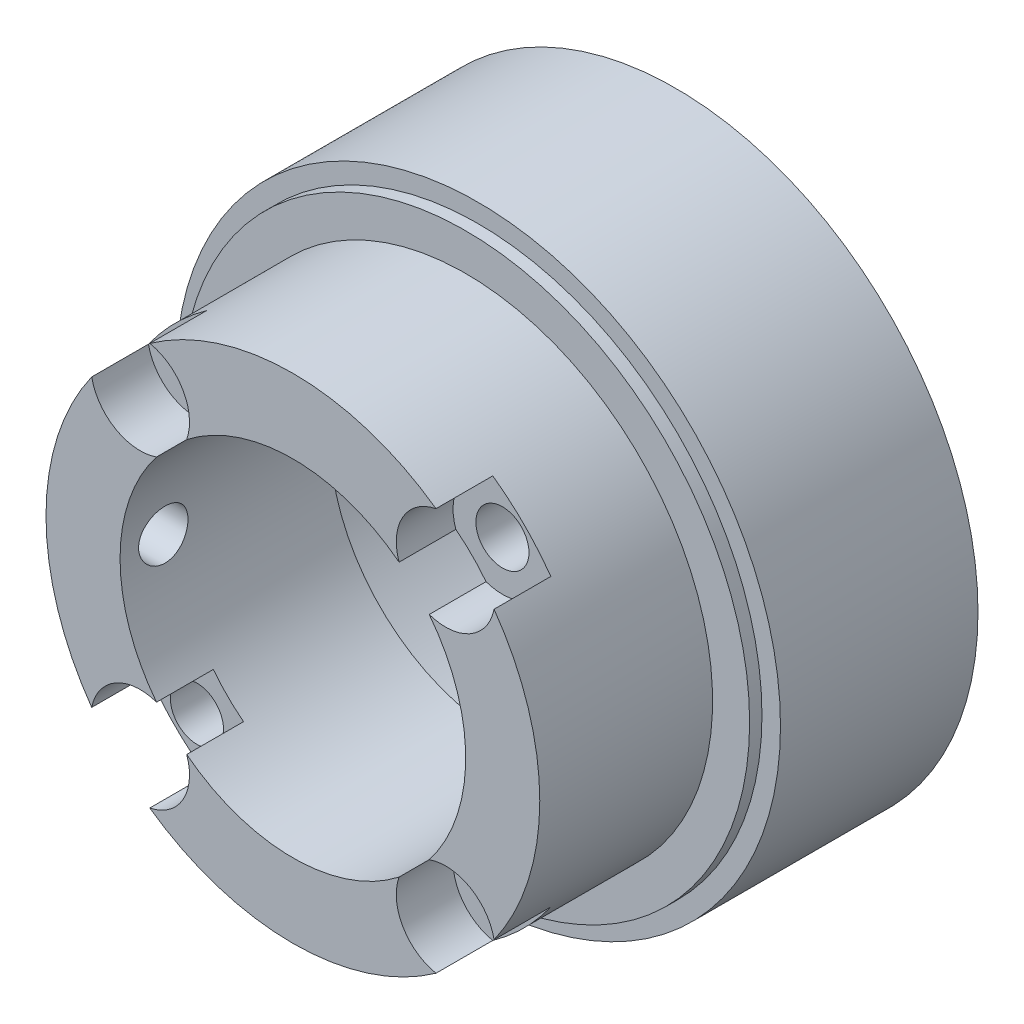
ISO-10303-21;
HEADER;
FILE_DESCRIPTION(('STEP AP214'),'2;1');
FILE_NAME('part.step','',(''),(''),'','','');
FILE_SCHEMA(('AUTOMOTIVE_DESIGN { 1 0 10303 214 1 1 1 1 }'));
ENDSEC;
DATA;
#1=APPLICATION_CONTEXT('core data for automotive mechanical design processes');
#2=APPLICATION_PROTOCOL_DEFINITION('international standard','automotive_design',2000,#1);
#3=PRODUCT_CONTEXT('',#1,'mechanical');
#4=PRODUCT('Part','Part','',(#3));
#5=PRODUCT_RELATED_PRODUCT_CATEGORY('part','',(#4));
#6=PRODUCT_DEFINITION_FORMATION('','',#4);
#7=PRODUCT_DEFINITION_CONTEXT('part definition',#1,'design');
#8=PRODUCT_DEFINITION('design','',#6,#7);
#9=PRODUCT_DEFINITION_SHAPE('','',#8);
#10=(LENGTH_UNIT() NAMED_UNIT(*) SI_UNIT(.MILLI.,.METRE.));
#11=(NAMED_UNIT(*) PLANE_ANGLE_UNIT() SI_UNIT($,.RADIAN.));
#12=(NAMED_UNIT(*) SI_UNIT($,.STERADIAN.) SOLID_ANGLE_UNIT());
#13=UNCERTAINTY_MEASURE_WITH_UNIT(LENGTH_MEASURE(1.E-05),#10,'distance_accuracy_value','');
#14=(GEOMETRIC_REPRESENTATION_CONTEXT(3) GLOBAL_UNCERTAINTY_ASSIGNED_CONTEXT((#13)) GLOBAL_UNIT_ASSIGNED_CONTEXT((#10,
#11,#12)) REPRESENTATION_CONTEXT('',''));
#15=CARTESIAN_POINT('',(0.,0.,0.));
#16=DIRECTION('',(0.,0.,1.));
#17=DIRECTION('',(1.,0.,0.));
#18=AXIS2_PLACEMENT_3D('',#15,#16,#17);
#19=CARTESIAN_POINT('',(0.,0.,0.));
#20=DIRECTION('',(0.,0.,-1.));
#21=DIRECTION('',(-1.,0.,0.));
#22=AXIS2_PLACEMENT_3D('',#19,#20,#21);
#23=PLANE('',#22);
#24=CARTESIAN_POINT('',(0.,0.,0.));
#25=DIRECTION('',(0.,0.,-1.));
#26=DIRECTION('',(-1.,0.,0.));
#27=AXIS2_PLACEMENT_3D('',#24,#25,#26);
#28=CIRCLE('',#27,20.);
#29=CARTESIAN_POINT('',(-20.,0.,0.));
#30=VERTEX_POINT('',#29);
#31=EDGE_CURVE('E307',#30,#30,#28,.T.);
#32=ORIENTED_EDGE('',*,*,#31,.T.);
#33=EDGE_LOOP('',(#32));
#34=FACE_BOUND('',#33,.T.);
#35=CARTESIAN_POINT('',(0.,0.,0.));
#36=DIRECTION('',(0.,0.,1.));
#37=DIRECTION('',(1.,0.,0.));
#38=AXIS2_PLACEMENT_3D('',#35,#36,#37);
#39=CIRCLE('',#38,23.);
#40=CARTESIAN_POINT('',(23.,0.,0.));
#41=VERTEX_POINT('',#40);
#42=EDGE_CURVE('E392',#41,#41,#39,.T.);
#43=ORIENTED_EDGE('',*,*,#42,.T.);
#44=EDGE_LOOP('',(#43));
#45=FACE_BOUND('',#44,.T.);
#46=ADVANCED_FACE('F38',(#34,#45),#23,.F.);
#47=CARTESIAN_POINT('',(0.,0.,-3.));
#48=DIRECTION('',(0.,0.,1.));
#49=DIRECTION('',(1.,0.,0.));
#50=AXIS2_PLACEMENT_3D('',#47,#48,#49);
#51=CYLINDRICAL_SURFACE('',#50,24.5);
#52=CARTESIAN_POINT('',(0.,0.,-17.));
#53=DIRECTION('',(0.,0.,-1.));
#54=DIRECTION('',(-1.,0.,0.));
#55=AXIS2_PLACEMENT_3D('',#52,#53,#54);
#56=CIRCLE('',#55,24.5);
#57=CARTESIAN_POINT('',(-24.5,0.,-17.));
#58=VERTEX_POINT('',#57);
#59=EDGE_CURVE('E299',#58,#58,#56,.T.);
#60=ORIENTED_EDGE('',*,*,#59,.F.);
#61=EDGE_LOOP('',(#60));
#62=FACE_BOUND('',#61,.T.);
#63=CARTESIAN_POINT('',(0.,0.,-1.));
#64=DIRECTION('',(0.,0.,1.));
#65=DIRECTION('',(1.,0.,0.));
#66=AXIS2_PLACEMENT_3D('',#63,#64,#65);
#67=CIRCLE('',#66,24.5);
#68=CARTESIAN_POINT('',(24.5,0.,-1.));
#69=VERTEX_POINT('',#68);
#70=EDGE_CURVE('E384',#69,#69,#67,.T.);
#71=ORIENTED_EDGE('',*,*,#70,.F.);
#72=EDGE_LOOP('',(#71));
#73=FACE_BOUND('',#72,.T.);
#74=ADVANCED_FACE('F489',(#62,#73),#51,.T.);
#75=CARTESIAN_POINT('',(0.,0.,14.));
#76=DIRECTION('',(0.,0.,1.));
#77=DIRECTION('',(1.,0.,0.));
#78=AXIS2_PLACEMENT_3D('',#75,#76,#77);
#79=PLANE('',#78);
#80=CARTESIAN_POINT('',(12.3743686707646,-12.3743686707646,14.));
#81=DIRECTION('',(0.,0.,1.));
#82=DIRECTION('',(1.,0.,0.));
#83=AXIS2_PLACEMENT_3D('',#80,#81,#82);
#84=CIRCLE('',#83,4.);
#85=CARTESIAN_POINT('',(16.2973096886323,-11.5930020664543,14.));
#86=VERTEX_POINT('',#85);
#87=CARTESIAN_POINT('',(11.0461328593506,-8.60133413218988,14.));
#88=VERTEX_POINT('',#87);
#89=EDGE_CURVE('E57',#86,#88,#84,.T.);
#90=ORIENTED_EDGE('',*,*,#89,.F.);
#91=CARTESIAN_POINT('',(0.,0.,14.));
#92=DIRECTION('',(0.,0.,1.));
#93=DIRECTION('',(1.,0.,0.));
#94=AXIS2_PLACEMENT_3D('',#91,#92,#93);
#95=CIRCLE('',#94,20.);
#96=CARTESIAN_POINT('',(16.2973096886322,11.5930020664543,14.));
#97=VERTEX_POINT('',#96);
#98=EDGE_CURVE('E207',#86,#97,#95,.T.);
#99=ORIENTED_EDGE('',*,*,#98,.T.);
#100=CARTESIAN_POINT('',(12.3743686707646,12.3743686707646,14.));
#101=DIRECTION('',(0.,0.,1.));
#102=DIRECTION('',(1.,0.,0.));
#103=AXIS2_PLACEMENT_3D('',#100,#101,#102);
#104=CIRCLE('',#103,4.);
#105=CARTESIAN_POINT('',(11.0461328593506,8.60133413218992,14.));
#106=VERTEX_POINT('',#105);
#107=EDGE_CURVE('E195',#106,#97,#104,.T.);
#108=ORIENTED_EDGE('',*,*,#107,.F.);
#109=CARTESIAN_POINT('',(0.,0.,14.));
#110=DIRECTION('',(0.,0.,1.));
#111=DIRECTION('',(1.,0.,0.));
#112=AXIS2_PLACEMENT_3D('',#109,#110,#111);
#113=CIRCLE('',#112,14.);
#114=EDGE_CURVE('E316',#88,#106,#113,.T.);
#115=ORIENTED_EDGE('',*,*,#114,.F.);
#116=EDGE_LOOP('',(#90,#99,#108,#115));
#117=FACE_BOUND('',#116,.T.);
#118=ADVANCED_FACE('F493',(#117),#79,.T.);
#119=CARTESIAN_POINT('',(11.5930020664543,16.2973096886323,14.));
#120=VERTEX_POINT('',#119);
#121=CARTESIAN_POINT('',(8.60133413218988,11.0461328593506,14.));
#122=VERTEX_POINT('',#121);
#123=EDGE_CURVE('E68',#120,#122,#104,.T.);
#124=ORIENTED_EDGE('',*,*,#123,.F.);
#125=CARTESIAN_POINT('',(-11.5930020664543,16.2973096886322,14.));
#126=VERTEX_POINT('',#125);
#127=EDGE_CURVE('E538',#120,#126,#95,.T.);
#128=ORIENTED_EDGE('',*,*,#127,.T.);
#129=CARTESIAN_POINT('',(-12.3743686707646,12.3743686707646,14.));
#130=DIRECTION('',(0.,0.,1.));
#131=DIRECTION('',(1.,0.,0.));
#132=AXIS2_PLACEMENT_3D('',#129,#130,#131);
#133=CIRCLE('',#132,4.);
#134=CARTESIAN_POINT('',(-8.60133413218993,11.0461328593506,14.));
#135=VERTEX_POINT('',#134);
#136=EDGE_CURVE('E242',#135,#126,#133,.T.);
#137=ORIENTED_EDGE('',*,*,#136,.F.);
#138=EDGE_CURVE('E517',#122,#135,#113,.T.);
#139=ORIENTED_EDGE('',*,*,#138,.F.);
#140=EDGE_LOOP('',(#124,#128,#137,#139));
#141=FACE_BOUND('',#140,.T.);
#142=ADVANCED_FACE('F504',(#141),#79,.T.);
#143=CARTESIAN_POINT('',(-16.2973096886323,11.5930020664543,14.));
#144=VERTEX_POINT('',#143);
#145=CARTESIAN_POINT('',(-11.0461328593506,8.60133413218989,14.));
#146=VERTEX_POINT('',#145);
#147=EDGE_CURVE('E246',#144,#146,#133,.T.);
#148=ORIENTED_EDGE('',*,*,#147,.F.);
#149=CARTESIAN_POINT('',(-16.2973096886322,-11.5930020664543,14.));
#150=VERTEX_POINT('',#149);
#151=EDGE_CURVE('E315',#144,#150,#95,.T.);
#152=ORIENTED_EDGE('',*,*,#151,.T.);
#153=CARTESIAN_POINT('',(-12.3743686707646,-12.3743686707646,14.));
#154=DIRECTION('',(0.,0.,1.));
#155=DIRECTION('',(1.,0.,0.));
#156=AXIS2_PLACEMENT_3D('',#153,#154,#155);
#157=CIRCLE('',#156,4.);
#158=CARTESIAN_POINT('',(-11.0461328593506,-8.60133413218994,14.));
#159=VERTEX_POINT('',#158);
#160=EDGE_CURVE('E272',#159,#150,#157,.T.);
#161=ORIENTED_EDGE('',*,*,#160,.F.);
#162=EDGE_CURVE('E311',#146,#159,#113,.T.);
#163=ORIENTED_EDGE('',*,*,#162,.F.);
#164=EDGE_LOOP('',(#148,#152,#161,#163));
#165=FACE_BOUND('',#164,.T.);
#166=ADVANCED_FACE('F498',(#165),#79,.T.);
#167=CARTESIAN_POINT('',(8.60133413218992,-11.0461328593506,14.));
#168=VERTEX_POINT('',#167);
#169=CARTESIAN_POINT('',(11.5930020664543,-16.2973096886322,14.));
#170=VERTEX_POINT('',#169);
#171=EDGE_CURVE('E382',#168,#170,#84,.T.);
#172=ORIENTED_EDGE('',*,*,#171,.F.);
#173=CARTESIAN_POINT('',(-8.60133413218988,-11.0461328593506,14.));
#174=VERTEX_POINT('',#173);
#175=EDGE_CURVE('E312',#174,#168,#113,.T.);
#176=ORIENTED_EDGE('',*,*,#175,.F.);
#177=CARTESIAN_POINT('',(-11.5930020664542,-16.2973096886323,14.));
#178=VERTEX_POINT('',#177);
#179=EDGE_CURVE('E269',#178,#174,#157,.T.);
#180=ORIENTED_EDGE('',*,*,#179,.F.);
#181=EDGE_CURVE('E317',#178,#170,#95,.T.);
#182=ORIENTED_EDGE('',*,*,#181,.T.);
#183=EDGE_LOOP('',(#172,#176,#180,#182));
#184=FACE_BOUND('',#183,.T.);
#185=ADVANCED_FACE('F380',(#184),#79,.T.);
#186=CARTESIAN_POINT('',(0.,0.,14.));
#187=DIRECTION('',(0.,0.,-1.));
#188=DIRECTION('',(-1.,0.,0.));
#189=AXIS2_PLACEMENT_3D('',#186,#187,#188);
#190=CYLINDRICAL_SURFACE('',#189,20.);
#191=CARTESIAN_POINT('',(-20.,0.,12.5));
#192=CARTESIAN_POINT('',(-19.9999987104154,0.112040707583114,12.4999951481992));
#193=CARTESIAN_POINT('',(-19.9990485119241,0.224155490335546,12.4905534622071));
#194=CARTESIAN_POINT('',(-19.9953493518948,0.445276796993674,12.4530312594191));
#195=CARTESIAN_POINT('',(-19.9925984086805,0.554279758337656,12.4249302079508));
#196=CARTESIAN_POINT('',(-19.9856082912614,0.765943350906829,12.3509155188043));
#197=CARTESIAN_POINT('',(-19.9813700160142,0.868607769229819,12.305012638963));
#198=CARTESIAN_POINT('',(-19.9718791478861,1.06475232192081,12.1967181841367));
#199=CARTESIAN_POINT('',(-19.9666267567626,1.15823427755815,12.1343298879997));
#200=CARTESIAN_POINT('',(-19.9556748868265,1.33371910134816,11.9945946046755));
#201=CARTESIAN_POINT('',(-19.9499740314773,1.41568428966978,11.9172004011959));
#202=CARTESIAN_POINT('',(-19.9387791381252,1.56548504286197,11.7497509314739));
#203=CARTESIAN_POINT('',(-19.9332851096983,1.63331995416531,11.6596950799152));
#204=CARTESIAN_POINT('',(-19.9231118310557,1.75306794088723,11.4692429366328));
#205=CARTESIAN_POINT('',(-19.9184343342181,1.80494693090976,11.3688251118103));
#206=CARTESIAN_POINT('',(-19.9104407509305,1.89109276948552,11.16064882819));
#207=CARTESIAN_POINT('',(-19.9071246308444,1.92536005318258,11.0528905508321));
#208=CARTESIAN_POINT('',(-19.9022416814596,1.97519808320379,10.833476398268));
#209=CARTESIAN_POINT('',(-19.9006690079619,1.99083130600759,10.7218348462956));
#210=CARTESIAN_POINT('',(-19.8994328612105,2.00315057027072,10.4975022732084));
#211=CARTESIAN_POINT('',(-19.8997693377749,1.9998371097416,10.3848112797559));
#212=CARTESIAN_POINT('',(-19.9023081379787,1.97440856050536,10.1620093806134));
#213=CARTESIAN_POINT('',(-19.904503691813,1.9523616882491,10.0518906013426));
#214=CARTESIAN_POINT('',(-19.9105026857484,1.89019828830117,9.83692407359781));
#215=CARTESIAN_POINT('',(-19.9143061475698,1.85008151651149,9.73207639634994));
#216=CARTESIAN_POINT('',(-19.9231001890414,1.75284178776301,9.53041282540222));
#217=CARTESIAN_POINT('',(-19.9280928781631,1.69568856543996,9.43361162102137));
#218=CARTESIAN_POINT('',(-19.9387010346576,1.56602005470645,9.25094957017624));
#219=CARTESIAN_POINT('',(-19.9443165202557,1.49350431667301,9.16508904403647));
#220=CARTESIAN_POINT('',(-19.9555677062598,1.33478822482414,9.00634921202195));
#221=CARTESIAN_POINT('',(-19.9612033866599,1.24852895770273,8.93352879623839));
#222=CARTESIAN_POINT('',(-19.9718365815704,1.06497896347422,8.80339273417922));
#223=CARTESIAN_POINT('',(-19.9768340953651,0.967688223999201,8.74607710528705));
#224=CARTESIAN_POINT('',(-19.9856295133419,0.764796211384728,8.64857995937949));
#225=CARTESIAN_POINT('',(-19.9894272082954,0.659193492779806,8.60840143036388));
#226=CARTESIAN_POINT('',(-19.9953929488282,0.442694434659863,8.5463621665765));
#227=CARTESIAN_POINT('',(-19.9975610431413,0.3317982535532,8.52450088401876));
#228=CARTESIAN_POINT('',(-20.0000170333662,0.108370198183807,8.49979138453047));
#229=CARTESIAN_POINT('',(-20.0003129653547,-0.00415260421098434,8.496861903495));
#230=CARTESIAN_POINT('',(-19.9990128351359,-0.2280875866314,8.50988572609753));
#231=CARTESIAN_POINT('',(-19.9974167984894,-0.33949978164094,8.52583877463056));
#232=CARTESIAN_POINT('',(-19.9925172307839,-0.557816413669349,8.57610739084315));
#233=CARTESIAN_POINT('',(-19.9892172383608,-0.664729697944038,8.61038490895602));
#234=CARTESIAN_POINT('',(-19.9812799772122,-0.871288642767563,8.69629034807454));
#235=CARTESIAN_POINT('',(-19.9766426785051,-0.970934140314234,8.7479186580788));
#236=CARTESIAN_POINT('',(-19.9665295066084,-1.16049636034428,8.86726167732783));
#237=CARTESIAN_POINT('',(-19.9610508720688,-1.25037931949783,8.93502977785164));
#238=CARTESIAN_POINT('',(-19.9498786573904,-1.41752324662376,9.08465213548186));
#239=CARTESIAN_POINT('',(-19.9441850718594,-1.49478389769835,9.16650674614064));
#240=CARTESIAN_POINT('',(-19.9332004828151,-1.63477221977429,9.342333149318));
#241=CARTESIAN_POINT('',(-19.9279110027795,-1.69744655735909,9.43634751308524));
#242=CARTESIAN_POINT('',(-19.9183566492178,-1.80611651748765,9.63361472029337));
#243=CARTESIAN_POINT('',(-19.9140917616808,-1.85211236810776,9.73686743737679));
#244=CARTESIAN_POINT('',(-19.907078952681,-1.92603041736895,9.94949747893159));
#245=CARTESIAN_POINT('',(-19.9043283689958,-1.95398434962372,10.0588636801822));
#246=CARTESIAN_POINT('',(-19.9006473056575,-1.99112801425892,10.2807663959215));
#247=CARTESIAN_POINT('',(-19.8997167738037,-2.00031828479903,10.3933028193913));
#248=CARTESIAN_POINT('',(-19.8997822621512,-1.99966627694251,10.6178213767134));
#249=CARTESIAN_POINT('',(-19.9007698017402,-1.98990777918622,10.7298037657656));
#250=CARTESIAN_POINT('',(-19.9045420777909,-1.9518109059273,10.9505298343366));
#251=CARTESIAN_POINT('',(-19.9073268162744,-1.92347250952432,11.059273510212));
#252=CARTESIAN_POINT('',(-19.9143773652637,-1.84904337259501,11.2704346980957));
#253=CARTESIAN_POINT('',(-19.9186429708072,-1.80295508868183,11.3728530832594));
#254=CARTESIAN_POINT('',(-19.9281750367872,-1.69434310982209,11.5685137833421));
#255=CARTESIAN_POINT('',(-19.933441491619,-1.63181950691083,11.6617561496413));
#256=CARTESIAN_POINT('',(-19.944409744194,-1.49179711257066,11.8368473489439));
#257=CARTESIAN_POINT('',(-19.950113294535,-1.41423589778054,11.9186461527342));
#258=CARTESIAN_POINT('',(-19.9612970945757,-1.24646339845022,12.0681044653993));
#259=CARTESIAN_POINT('',(-19.9667772904595,-1.15624908821651,12.1357605827143));
#260=CARTESIAN_POINT('',(-19.9769112413832,-0.965482868322578,12.2551469077092));
#261=CARTESIAN_POINT('',(-19.9815628805362,-0.864905498693527,12.3068365818904));
#262=CARTESIAN_POINT('',(-19.9894925849979,-0.656516558201101,12.3925248456477));
#263=CARTESIAN_POINT('',(-19.9927721981931,-0.548713299651218,12.4265433819071));
#264=CARTESIAN_POINT('',(-19.9967642754747,-0.366916522811408,12.4674412341696));
#265=CARTESIAN_POINT('',(-19.9979720138367,-0.294085105689017,12.4796340885987));
#266=CARTESIAN_POINT('',(-19.9995902990157,-0.147513161634625,12.4959150521235));
#267=CARTESIAN_POINT('',(-20.0000008491205,-0.0737726384531152,12.5000031946437));
#268=CARTESIAN_POINT('',(-20.,0.,12.5));
#269=B_SPLINE_CURVE_WITH_KNOTS('',3,(#191,#192,#193,#194,#195,#196,#197,#198,#199,#200,#201,
#202,#203,#204,#205,#206,#207,#208,#209,#210,#211,#212,#213,#214,#215,#216,#217,#218,#219,#220,
#221,#222,#223,#224,#225,#226,#227,#228,#229,#230,#231,#232,#233,#234,#235,#236,#237,#238,#239,
#240,#241,#242,#243,#244,#245,#246,#247,#248,#249,#250,#251,#252,#253,#254,#255,#256,#257,#258,
#259,#260,#261,#262,#263,#264,#265,#266,#267,#268),.UNSPECIFIED.,.T.,.F.,(4,2,2,2,2,2,2,2,2,2,2,
2,2,2,2,2,2,2,2,2,2,2,2,2,2,2,2,2,2,2,2,2,2,2,2,2,2,2,4),(0.,0.335852732536947,
0.672075685670973,1.00809577146441,1.34404907516556,1.68107713724589,2.01812078441412,
2.35587950944444,2.69362988885008,3.03024464090393,3.36685054511553,3.70223594882221,
4.03762588323267,4.37361522745789,4.70961440662251,5.04709468392413,5.38457533959543,
5.72211481387163,6.05964419350879,6.39572377215515,6.73179881038287,7.06717870588609,
7.40256612098934,7.73907881497397,8.0755999562046,8.41333287217197,8.75106116950748,
9.08819381186006,9.4253167847917,9.76095258587912,10.0965887645208,10.432178507256,
10.7677663707792,11.1047783485531,11.4418710527392,11.7798126205248,12.1173718959059,
12.338513344647,12.5596538813805),.UNSPECIFIED.);
#270=CARTESIAN_POINT('',(-20.,0.,12.5));
#271=VERTEX_POINT('',#270);
#272=EDGE_CURVE('E407',#271,#271,#269,.T.);
#273=ORIENTED_EDGE('',*,*,#272,.F.);
#274=EDGE_LOOP('',(#273));
#275=FACE_BOUND('',#274,.T.);
#276=CARTESIAN_POINT('',(0.,0.,9.4));
#277=DIRECTION('',(0.,0.,-1.));
#278=DIRECTION('',(-1.,0.,0.));
#279=AXIS2_PLACEMENT_3D('',#276,#277,#278);
#280=CIRCLE('',#279,20.);
#281=CARTESIAN_POINT('',(16.2973096886323,-11.5930020664543,9.4));
#282=VERTEX_POINT('',#281);
#283=CARTESIAN_POINT('',(11.5930020664543,-16.2973096886322,9.4));
#284=VERTEX_POINT('',#283);
#285=EDGE_CURVE('E184',#282,#284,#280,.T.);
#286=ORIENTED_EDGE('',*,*,#285,.T.);
#287=DIRECTION('',(0.,0.,1.));
#288=VECTOR('',#287,1.);
#289=CARTESIAN_POINT('',(11.5930020664543,-16.2973096886322,11.7));
#290=LINE('',#289,#288);
#291=EDGE_CURVE('E196',#284,#170,#290,.T.);
#292=ORIENTED_EDGE('',*,*,#291,.T.);
#293=ORIENTED_EDGE('',*,*,#181,.F.);
#294=DIRECTION('',(0.,0.,1.));
#295=VECTOR('',#294,1.);
#296=CARTESIAN_POINT('',(-11.5930020664542,-16.2973096886323,11.7));
#297=LINE('',#296,#295);
#298=CARTESIAN_POINT('',(-11.5930020664542,-16.2973096886323,9.4));
#299=VERTEX_POINT('',#298);
#300=EDGE_CURVE('E283',#178,#299,#297,.F.);
#301=ORIENTED_EDGE('',*,*,#300,.T.);
#302=CARTESIAN_POINT('',(0.,0.,9.4));
#303=DIRECTION('',(0.,0.,-1.));
#304=DIRECTION('',(-1.,0.,0.));
#305=AXIS2_PLACEMENT_3D('',#302,#303,#304);
#306=CIRCLE('',#305,20.);
#307=CARTESIAN_POINT('',(-16.2973096886322,-11.5930020664543,9.4));
#308=VERTEX_POINT('',#307);
#309=EDGE_CURVE('E291',#299,#308,#306,.T.);
#310=ORIENTED_EDGE('',*,*,#309,.T.);
#311=DIRECTION('',(0.,0.,1.));
#312=VECTOR('',#311,1.);
#313=CARTESIAN_POINT('',(-16.2973096886322,-11.5930020664543,11.7));
#314=LINE('',#313,#312);
#315=EDGE_CURVE('E287',#308,#150,#314,.T.);
#316=ORIENTED_EDGE('',*,*,#315,.T.);
#317=ORIENTED_EDGE('',*,*,#151,.F.);
#318=DIRECTION('',(0.,0.,1.));
#319=VECTOR('',#318,1.);
#320=CARTESIAN_POINT('',(-16.2973096886323,11.5930020664543,11.7));
#321=LINE('',#320,#319);
#322=CARTESIAN_POINT('',(-16.2973096886323,11.5930020664543,9.4));
#323=VERTEX_POINT('',#322);
#324=EDGE_CURVE('E257',#144,#323,#321,.F.);
#325=ORIENTED_EDGE('',*,*,#324,.T.);
#326=CARTESIAN_POINT('',(0.,0.,9.4));
#327=DIRECTION('',(0.,0.,-1.));
#328=DIRECTION('',(-1.,0.,0.));
#329=AXIS2_PLACEMENT_3D('',#326,#327,#328);
#330=CIRCLE('',#329,20.);
#331=CARTESIAN_POINT('',(-11.5930020664543,16.2973096886322,9.4));
#332=VERTEX_POINT('',#331);
#333=EDGE_CURVE('E265',#323,#332,#330,.T.);
#334=ORIENTED_EDGE('',*,*,#333,.T.);
#335=DIRECTION('',(0.,0.,1.));
#336=VECTOR('',#335,1.);
#337=CARTESIAN_POINT('',(-11.5930020664543,16.2973096886322,11.7));
#338=LINE('',#337,#336);
#339=EDGE_CURVE('E261',#332,#126,#338,.T.);
#340=ORIENTED_EDGE('',*,*,#339,.T.);
#341=ORIENTED_EDGE('',*,*,#127,.F.);
#342=DIRECTION('',(0.,0.,1.));
#343=VECTOR('',#342,1.);
#344=CARTESIAN_POINT('',(11.5930020664543,16.2973096886323,11.7));
#345=LINE('',#344,#343);
#346=CARTESIAN_POINT('',(11.5930020664543,16.2973096886323,9.4));
#347=VERTEX_POINT('',#346);
#348=EDGE_CURVE('E231',#120,#347,#345,.F.);
#349=ORIENTED_EDGE('',*,*,#348,.T.);
#350=CARTESIAN_POINT('',(0.,0.,9.4));
#351=DIRECTION('',(0.,0.,-1.));
#352=DIRECTION('',(-1.,0.,0.));
#353=AXIS2_PLACEMENT_3D('',#350,#351,#352);
#354=CIRCLE('',#353,20.);
#355=CARTESIAN_POINT('',(16.2973096886322,11.5930020664543,9.4));
#356=VERTEX_POINT('',#355);
#357=EDGE_CURVE('E238',#347,#356,#354,.T.);
#358=ORIENTED_EDGE('',*,*,#357,.T.);
#359=DIRECTION('',(0.,0.,1.));
#360=VECTOR('',#359,1.);
#361=CARTESIAN_POINT('',(16.2973096886322,11.5930020664543,11.7));
#362=LINE('',#361,#360);
#363=EDGE_CURVE('E235',#356,#97,#362,.T.);
#364=ORIENTED_EDGE('',*,*,#363,.T.);
#365=ORIENTED_EDGE('',*,*,#98,.F.);
#366=DIRECTION('',(0.,0.,1.));
#367=VECTOR('',#366,1.);
#368=CARTESIAN_POINT('',(16.2973096886323,-11.5930020664543,11.7));
#369=LINE('',#368,#367);
#370=EDGE_CURVE('E199',#86,#282,#369,.F.);
#371=ORIENTED_EDGE('',*,*,#370,.T.);
#372=EDGE_LOOP('',(#286,#292,#293,#301,#310,#316,#317,#325,#334,#340,#341,#349,#358,#364,#365,#371));
#373=FACE_BOUND('',#372,.T.);
#374=ORIENTED_EDGE('',*,*,#31,.F.);
#375=EDGE_LOOP('',(#374));
#376=FACE_BOUND('',#375,.T.);
#377=ADVANCED_FACE('F40',(#275,#373,#376),#190,.T.);
#378=CARTESIAN_POINT('',(0.,0.,14.));
#379=DIRECTION('',(0.,0.,-1.));
#380=DIRECTION('',(-1.,0.,0.));
#381=AXIS2_PLACEMENT_3D('',#378,#379,#380);
#382=CYLINDRICAL_SURFACE('',#381,14.);
#383=CARTESIAN_POINT('',(-14.,0.,12.5));
#384=CARTESIAN_POINT('',(-13.9999982704576,0.111730729412821,12.4999953468224));
#385=CARTESIAN_POINT('',(-13.9986484040059,0.223527810991033,12.4906055856812));
#386=CARTESIAN_POINT('',(-13.9933934101175,0.444001320736161,12.453301727532));
#387=CARTESIAN_POINT('',(-13.9894857399261,0.552674531066956,12.4253691964592));
#388=CARTESIAN_POINT('',(-13.9795546032365,0.763677353570884,12.3518278765315));
#389=CARTESIAN_POINT('',(-13.9735326833659,0.866011538699541,12.306232006347));
#390=CARTESIAN_POINT('',(-13.9600397816117,1.06155930048063,12.1986889142093));
#391=CARTESIAN_POINT('',(-13.9525690153005,1.1547742308773,12.1367441243008));
#392=CARTESIAN_POINT('',(-13.9369507824178,1.33011730079462,11.9977916576655));
#393=CARTESIAN_POINT('',(-13.9287993153496,1.4121711816013,11.9206907142842));
#394=CARTESIAN_POINT('',(-13.9127699964244,1.56222258353725,11.7538151709207));
#395=CARTESIAN_POINT('',(-13.9048921597561,1.63021932541739,11.664039868807));
#396=CARTESIAN_POINT('',(-13.8902631298137,1.75051175284446,11.4738697678925));
#397=CARTESIAN_POINT('',(-13.8835171039926,1.80273625094777,11.3734295074297));
#398=CARTESIAN_POINT('',(-13.8719696531257,1.8895469033362,11.1650909210179));
#399=CARTESIAN_POINT('',(-13.8671681320043,1.92413392908997,11.0571929638534));
#400=CARTESIAN_POINT('',(-13.8600923875319,1.97445864012233,10.837779980344));
#401=CARTESIAN_POINT('',(-13.8578011904721,1.99032297705591,10.7262945601444));
#402=CARTESIAN_POINT('',(-13.8559538769084,2.00314420015137,10.5022221891304));
#403=CARTESIAN_POINT('',(-13.8563976177408,2.00010207253958,10.3896352960786));
#404=CARTESIAN_POINT('',(-13.8599545154206,1.97530036195882,10.1674469093339));
#405=CARTESIAN_POINT('',(-13.8630476220424,1.95368136359299,10.0578293559083));
#406=CARTESIAN_POINT('',(-13.8715234337902,1.89255944642857,9.84379382743148));
#407=CARTESIAN_POINT('',(-13.8769061981508,1.85305606494963,9.73937598697767));
#408=CARTESIAN_POINT('',(-13.8893771547056,1.75713904249907,9.53827345378315));
#409=CARTESIAN_POINT('',(-13.8964713816251,1.70066538623268,9.4416177752284));
#410=CARTESIAN_POINT('',(-13.9115614778013,1.57245369144076,9.2591015756214));
#411=CARTESIAN_POINT('',(-13.9195574007903,1.50071474302511,9.17324169854012));
#412=CARTESIAN_POINT('',(-13.935638713609,1.34323491742878,9.01393919377074));
#413=CARTESIAN_POINT('',(-13.9437242576907,1.25737307515522,8.94061610988009));
#414=CARTESIAN_POINT('',(-13.9590063579119,1.07449831880178,8.80940299755347));
#415=CARTESIAN_POINT('',(-13.9662029107845,0.97748536374498,8.75151302583206));
#416=CARTESIAN_POINT('',(-13.9789027062694,0.774962079627689,8.65280512500142));
#417=CARTESIAN_POINT('',(-13.9844050861204,0.66944745546731,8.61199589050573));
#418=CARTESIAN_POINT('',(-13.9930891989204,0.452966698754195,8.54870906136051));
#419=CARTESIAN_POINT('',(-13.9962710740431,0.342000900631282,8.52623034361818));
#420=CARTESIAN_POINT('',(-13.9999369457274,0.118800022389946,8.50040037317957));
#421=CARTESIAN_POINT('',(-14.0004441362448,0.00658433954239145,8.4968846735315));
#422=CARTESIAN_POINT('',(-13.998766472677,-0.216834850313295,8.50864480802009));
#423=CARTESIAN_POINT('',(-13.9965816939732,-0.328038385576057,8.52392011596509));
#424=CARTESIAN_POINT('',(-13.989779937323,-0.545782417984486,8.57269194159471));
#425=CARTESIAN_POINT('',(-13.9851735873009,-0.652341104920121,8.60610885917956));
#426=CARTESIAN_POINT('',(-13.9740437427243,-0.85834294402468,8.69013173929542));
#427=CARTESIAN_POINT('',(-13.9675201654863,-0.957785789081079,8.74073844317914));
#428=CARTESIAN_POINT('',(-13.9532237717093,-1.14745969579786,8.85809381698746));
#429=CARTESIAN_POINT('',(-13.9454429484921,-1.23762521269797,8.92494742970546));
#430=CARTESIAN_POINT('',(-13.9295244643077,-1.40551529480486,9.07275207605226));
#431=CARTESIAN_POINT('',(-13.9213867846415,-1.48323920707858,9.15370384908467));
#432=CARTESIAN_POINT('',(-13.905598801697,-1.62463364620767,9.32813670096446));
#433=CARTESIAN_POINT('',(-13.8979526154851,-1.68819430084838,9.42170727030052));
#434=CARTESIAN_POINT('',(-13.8840847148081,-1.79869568753914,9.618293186604));
#435=CARTESIAN_POINT('',(-13.8778629647358,-1.84563683505083,9.72130829739161));
#436=CARTESIAN_POINT('',(-13.8675777026176,-1.92139410758533,9.93352330450629));
#437=CARTESIAN_POINT('',(-13.8635071637923,-1.9502693013197,10.0427017588413));
#438=CARTESIAN_POINT('',(-13.8579660926443,-1.98926373200153,10.2644205610556));
#439=CARTESIAN_POINT('',(-13.8564953988287,-1.99938413393019,10.3769606996777));
#440=CARTESIAN_POINT('',(-13.8563261774508,-2.00055590374211,10.6011138265213));
#441=CARTESIAN_POINT('',(-13.8576025432318,-1.99177997367806,10.7127259316553));
#442=CARTESIAN_POINT('',(-13.8627292421198,-1.955776958508,10.9328701240585));
#443=CARTESIAN_POINT('',(-13.8665795725747,-1.92854989241351,11.041402214501));
#444=CARTESIAN_POINT('',(-13.8764118947751,-1.85647645565796,11.2522652651112));
#445=CARTESIAN_POINT('',(-13.8823925621769,-1.81164102962601,11.354600031763));
#446=CARTESIAN_POINT('',(-13.8958134572738,-1.70564064203087,11.5503224449534));
#447=CARTESIAN_POINT('',(-13.9032537250596,-1.6444752319184,11.6437098456314));
#448=CARTESIAN_POINT('',(-13.9188366265289,-1.50691947463095,11.8197658185289));
#449=CARTESIAN_POINT('',(-13.9269848226365,-1.43040092940365,11.9023337452022));
#450=CARTESIAN_POINT('',(-13.9430182205406,-1.26458151332115,12.0535197074322));
#451=CARTESIAN_POINT('',(-13.9509033605333,-1.17527766433494,12.1221344837885));
#452=CARTESIAN_POINT('',(-13.9655666249256,-0.985903424533845,12.2437675720361));
#453=CARTESIAN_POINT('',(-13.9723390511953,-0.885781717454297,12.2967066541579));
#454=CARTESIAN_POINT('',(-13.9839575607488,-0.678021288370036,12.3849397440061));
#455=CARTESIAN_POINT('',(-13.9888056680308,-0.570390605198981,12.4202523014324));
#456=CARTESIAN_POINT('',(-13.9949036300505,-0.385211363997557,12.4640835869126));
#457=CARTESIAN_POINT('',(-13.9968051085646,-0.308813899178573,12.4775320369382));
#458=CARTESIAN_POINT('',(-13.9993538865779,-0.154954921365663,12.4954918090882));
#459=CARTESIAN_POINT('',(-14.0000011995639,-0.0774934198230615,12.5000032273185));
#460=CARTESIAN_POINT('',(-14.,0.,12.5));
#461=B_SPLINE_CURVE_WITH_KNOTS('',3,(#383,#384,#385,#386,#387,#388,#389,#390,#391,#392,#393,
#394,#395,#396,#397,#398,#399,#400,#401,#402,#403,#404,#405,#406,#407,#408,#409,#410,#411,#412,
#413,#414,#415,#416,#417,#418,#419,#420,#421,#422,#423,#424,#425,#426,#427,#428,#429,#430,#431,
#432,#433,#434,#435,#436,#437,#438,#439,#440,#441,#442,#443,#444,#445,#446,#447,#448,#449,#450,
#451,#452,#453,#454,#455,#456,#457,#458,#459,#460),.UNSPECIFIED.,.T.,.F.,(4,2,2,2,2,2,2,2,2,2,2,
2,2,2,2,2,2,2,2,2,2,2,2,2,2,2,2,2,2,2,2,2,2,2,2,2,2,2,4),(0.,0.334909053352876,
0.670151551991671,1.0051493213937,1.34009728501034,1.67717486857613,2.01427113282988,
2.35286688085115,2.69144589721316,3.02772118641954,3.36397893449558,3.69771416579721,
4.03145803153491,4.36639635621899,4.70135465054929,5.03934756706696,5.3773417256446,
5.71550772487662,6.05365300345248,6.38886112086085,6.7240598518806,7.0577995773694,
7.3915536980499,7.72752375986629,8.06351144755164,8.40202124724692,8.74052258413026,
9.07791128740848,9.41527903259351,9.74957651847121,10.0838736598988,10.4179633440508,
10.752062205867,11.0890764750947,11.4261693744911,11.7649380499931,12.1033494584613,
12.3356358411576,12.5679197259081),.UNSPECIFIED.);
#462=CARTESIAN_POINT('',(-14.,0.,12.5));
#463=VERTEX_POINT('',#462);
#464=EDGE_CURVE('E396',#463,#463,#461,.T.);
#465=ORIENTED_EDGE('',*,*,#464,.T.);
#466=EDGE_LOOP('',(#465));
#467=FACE_BOUND('',#466,.T.);
#468=DIRECTION('',(0.,0.,1.));
#469=VECTOR('',#468,1.);
#470=CARTESIAN_POINT('',(8.60133413218992,-11.0461328593506,11.7));
#471=LINE('',#470,#469);
#472=CARTESIAN_POINT('',(8.60133413218992,-11.0461328593506,9.4));
#473=VERTEX_POINT('',#472);
#474=EDGE_CURVE('E11',#473,#168,#471,.T.);
#475=ORIENTED_EDGE('',*,*,#474,.F.);
#476=CARTESIAN_POINT('',(0.,0.,9.4));
#477=DIRECTION('',(0.,0.,-1.));
#478=DIRECTION('',(-1.,0.,0.));
#479=AXIS2_PLACEMENT_3D('',#476,#477,#478);
#480=CIRCLE('',#479,14.);
#481=CARTESIAN_POINT('',(11.0461328593506,-8.60133413218988,9.4));
#482=VERTEX_POINT('',#481);
#483=EDGE_CURVE('E47',#482,#473,#480,.T.);
#484=ORIENTED_EDGE('',*,*,#483,.F.);
#485=DIRECTION('',(0.,0.,1.));
#486=VECTOR('',#485,1.);
#487=CARTESIAN_POINT('',(11.0461328593506,-8.60133413218988,11.7));
#488=LINE('',#487,#486);
#489=EDGE_CURVE('E200',#88,#482,#488,.F.);
#490=ORIENTED_EDGE('',*,*,#489,.F.);
#491=ORIENTED_EDGE('',*,*,#114,.T.);
#492=DIRECTION('',(0.,0.,1.));
#493=VECTOR('',#492,1.);
#494=CARTESIAN_POINT('',(11.0461328593506,8.60133413218992,11.7));
#495=LINE('',#494,#493);
#496=CARTESIAN_POINT('',(11.0461328593506,8.60133413218992,9.4));
#497=VERTEX_POINT('',#496);
#498=EDGE_CURVE('E360',#497,#106,#495,.T.);
#499=ORIENTED_EDGE('',*,*,#498,.F.);
#500=CARTESIAN_POINT('',(0.,0.,9.4));
#501=DIRECTION('',(0.,0.,-1.));
#502=DIRECTION('',(-1.,0.,0.));
#503=AXIS2_PLACEMENT_3D('',#500,#501,#502);
#504=CIRCLE('',#503,14.);
#505=CARTESIAN_POINT('',(8.60133413218988,11.0461328593506,9.4));
#506=VERTEX_POINT('',#505);
#507=EDGE_CURVE('E357',#506,#497,#504,.T.);
#508=ORIENTED_EDGE('',*,*,#507,.F.);
#509=DIRECTION('',(0.,0.,1.));
#510=VECTOR('',#509,1.);
#511=CARTESIAN_POINT('',(8.60133413218988,11.0461328593506,11.7));
#512=LINE('',#511,#510);
#513=EDGE_CURVE('E351',#122,#506,#512,.F.);
#514=ORIENTED_EDGE('',*,*,#513,.F.);
#515=ORIENTED_EDGE('',*,*,#138,.T.);
#516=DIRECTION('',(0.,0.,1.));
#517=VECTOR('',#516,1.);
#518=CARTESIAN_POINT('',(-8.60133413218993,11.0461328593506,11.7));
#519=LINE('',#518,#517);
#520=CARTESIAN_POINT('',(-8.60133413218993,11.0461328593506,9.4));
#521=VERTEX_POINT('',#520);
#522=EDGE_CURVE('E347',#521,#135,#519,.T.);
#523=ORIENTED_EDGE('',*,*,#522,.F.);
#524=CARTESIAN_POINT('',(0.,0.,9.4));
#525=DIRECTION('',(0.,0.,-1.));
#526=DIRECTION('',(-1.,0.,0.));
#527=AXIS2_PLACEMENT_3D('',#524,#525,#526);
#528=CIRCLE('',#527,14.);
#529=CARTESIAN_POINT('',(-11.0461328593506,8.60133413218989,9.4));
#530=VERTEX_POINT('',#529);
#531=EDGE_CURVE('E344',#530,#521,#528,.T.);
#532=ORIENTED_EDGE('',*,*,#531,.F.);
#533=DIRECTION('',(0.,0.,1.));
#534=VECTOR('',#533,1.);
#535=CARTESIAN_POINT('',(-11.0461328593506,8.60133413218989,11.7));
#536=LINE('',#535,#534);
#537=EDGE_CURVE('E338',#146,#530,#536,.F.);
#538=ORIENTED_EDGE('',*,*,#537,.F.);
#539=ORIENTED_EDGE('',*,*,#162,.T.);
#540=DIRECTION('',(0.,0.,1.));
#541=VECTOR('',#540,1.);
#542=CARTESIAN_POINT('',(-11.0461328593506,-8.60133413218994,11.7));
#543=LINE('',#542,#541);
#544=CARTESIAN_POINT('',(-11.0461328593506,-8.60133413218994,9.4));
#545=VERTEX_POINT('',#544);
#546=EDGE_CURVE('E334',#545,#159,#543,.T.);
#547=ORIENTED_EDGE('',*,*,#546,.F.);
#548=CARTESIAN_POINT('',(0.,0.,9.4));
#549=DIRECTION('',(0.,0.,-1.));
#550=DIRECTION('',(-1.,0.,0.));
#551=AXIS2_PLACEMENT_3D('',#548,#549,#550);
#552=CIRCLE('',#551,14.);
#553=CARTESIAN_POINT('',(-8.60133413218988,-11.0461328593506,9.4));
#554=VERTEX_POINT('',#553);
#555=EDGE_CURVE('E331',#554,#545,#552,.T.);
#556=ORIENTED_EDGE('',*,*,#555,.F.);
#557=DIRECTION('',(0.,0.,1.));
#558=VECTOR('',#557,1.);
#559=CARTESIAN_POINT('',(-8.60133413218988,-11.0461328593506,11.7));
#560=LINE('',#559,#558);
#561=EDGE_CURVE('E325',#174,#554,#560,.F.);
#562=ORIENTED_EDGE('',*,*,#561,.F.);
#563=ORIENTED_EDGE('',*,*,#175,.T.);
#564=EDGE_LOOP('',(#475,#484,#490,#491,#499,#508,#514,#515,#523,#532,#538,#539,#547,#556,#562,#563));
#565=FACE_BOUND('',#564,.T.);
#566=CARTESIAN_POINT('',(0.,0.,-3.));
#567=DIRECTION('',(0.,0.,-1.));
#568=DIRECTION('',(-1.,0.,0.));
#569=AXIS2_PLACEMENT_3D('',#566,#567,#568);
#570=CIRCLE('',#569,14.);
#571=CARTESIAN_POINT('',(-14.,0.,-3.));
#572=VERTEX_POINT('',#571);
#573=EDGE_CURVE('E303',#572,#572,#570,.T.);
#574=ORIENTED_EDGE('',*,*,#573,.T.);
#575=EDGE_LOOP('',(#574));
#576=FACE_BOUND('',#575,.T.);
#577=ADVANCED_FACE('F373',(#467,#565,#576),#382,.F.);
#578=CARTESIAN_POINT('',(0.,0.,-3.));
#579=DIRECTION('',(0.,0.,-1.));
#580=DIRECTION('',(-1.,0.,0.));
#581=AXIS2_PLACEMENT_3D('',#578,#579,#580);
#582=PLANE('',#581);
#583=CARTESIAN_POINT('',(12.3743686707646,-12.3743686707646,-3.));
#584=DIRECTION('',(0.,0.,-1.));
#585=DIRECTION('',(-1.,0.,0.));
#586=AXIS2_PLACEMENT_3D('',#583,#584,#585);
#587=CIRCLE('',#586,2.15);
#588=CARTESIAN_POINT('',(10.2243686707646,-12.3743686707646,-3.));
#589=VERTEX_POINT('',#588);
#590=EDGE_CURVE('E209',#589,#589,#587,.T.);
#591=ORIENTED_EDGE('',*,*,#590,.F.);
#592=EDGE_LOOP('',(#591));
#593=FACE_BOUND('',#592,.T.);
#594=CARTESIAN_POINT('',(12.3743686707646,12.3743686707646,-3.));
#595=DIRECTION('',(0.,0.,-1.));
#596=DIRECTION('',(-1.,0.,0.));
#597=AXIS2_PLACEMENT_3D('',#594,#595,#596);
#598=CIRCLE('',#597,2.15);
#599=CARTESIAN_POINT('',(10.2243686707646,12.3743686707646,-3.));
#600=VERTEX_POINT('',#599);
#601=EDGE_CURVE('E230',#600,#600,#598,.T.);
#602=ORIENTED_EDGE('',*,*,#601,.F.);
#603=EDGE_LOOP('',(#602));
#604=FACE_BOUND('',#603,.T.);
#605=CARTESIAN_POINT('',(-12.3743686707646,12.3743686707646,-3.));
#606=DIRECTION('',(0.,0.,-1.));
#607=DIRECTION('',(-1.,0.,0.));
#608=AXIS2_PLACEMENT_3D('',#605,#606,#607);
#609=CIRCLE('',#608,2.15);
#610=CARTESIAN_POINT('',(-14.5243686707646,12.3743686707646,-3.));
#611=VERTEX_POINT('',#610);
#612=EDGE_CURVE('E256',#611,#611,#609,.T.);
#613=ORIENTED_EDGE('',*,*,#612,.F.);
#614=EDGE_LOOP('',(#613));
#615=FACE_BOUND('',#614,.T.);
#616=CARTESIAN_POINT('',(-12.3743686707646,-12.3743686707646,-3.));
#617=DIRECTION('',(0.,0.,-1.));
#618=DIRECTION('',(-1.,0.,0.));
#619=AXIS2_PLACEMENT_3D('',#616,#617,#618);
#620=CIRCLE('',#619,2.15);
#621=CARTESIAN_POINT('',(-14.5243686707646,-12.3743686707646,-3.));
#622=VERTEX_POINT('',#621);
#623=EDGE_CURVE('E282',#622,#622,#620,.T.);
#624=ORIENTED_EDGE('',*,*,#623,.F.);
#625=EDGE_LOOP('',(#624));
#626=FACE_BOUND('',#625,.T.);
#627=CARTESIAN_POINT('',(0.,0.,-3.));
#628=DIRECTION('',(0.,0.,-1.));
#629=DIRECTION('',(-1.,0.,0.));
#630=AXIS2_PLACEMENT_3D('',#627,#628,#629);
#631=CIRCLE('',#630,21.);
#632=CARTESIAN_POINT('',(-21.,0.,-3.));
#633=VERTEX_POINT('',#632);
#634=EDGE_CURVE('E321',#633,#633,#631,.F.);
#635=ORIENTED_EDGE('',*,*,#634,.F.);
#636=EDGE_LOOP('',(#635));
#637=FACE_BOUND('',#636,.T.);
#638=ORIENTED_EDGE('',*,*,#573,.F.);
#639=EDGE_LOOP('',(#638));
#640=FACE_BOUND('',#639,.T.);
#641=ADVANCED_FACE('F482',(#593,#604,#615,#626,#637,#640),#582,.T.);
#642=CARTESIAN_POINT('',(0.,0.,-17.));
#643=DIRECTION('',(0.,0.,-1.));
#644=DIRECTION('',(-1.,0.,0.));
#645=AXIS2_PLACEMENT_3D('',#642,#643,#644);
#646=PLANE('',#645);
#647=ORIENTED_EDGE('',*,*,#59,.T.);
#648=EDGE_LOOP('',(#647));
#649=FACE_BOUND('',#648,.T.);
#650=CARTESIAN_POINT('',(0.,0.,-17.));
#651=DIRECTION('',(0.,0.,-1.));
#652=DIRECTION('',(-1.,0.,0.));
#653=AXIS2_PLACEMENT_3D('',#650,#651,#652);
#654=CIRCLE('',#653,21.);
#655=CARTESIAN_POINT('',(-21.,0.,-17.));
#656=VERTEX_POINT('',#655);
#657=EDGE_CURVE('E295',#656,#656,#654,.T.);
#658=ORIENTED_EDGE('',*,*,#657,.F.);
#659=EDGE_LOOP('',(#658));
#660=FACE_BOUND('',#659,.T.);
#661=ADVANCED_FACE('F478',(#649,#660),#646,.T.);
#662=CARTESIAN_POINT('',(0.,0.,-17.));
#663=DIRECTION('',(0.,0.,1.));
#664=DIRECTION('',(1.,0.,0.));
#665=AXIS2_PLACEMENT_3D('',#662,#663,#664);
#666=CYLINDRICAL_SURFACE('',#665,21.);
#667=ORIENTED_EDGE('',*,*,#657,.T.);
#668=EDGE_LOOP('',(#667));
#669=FACE_BOUND('',#668,.T.);
#670=ORIENTED_EDGE('',*,*,#634,.T.);
#671=EDGE_LOOP('',(#670));
#672=FACE_BOUND('',#671,.T.);
#673=ADVANCED_FACE('F471',(#669,#672),#666,.F.);
#674=CARTESIAN_POINT('',(-10.2243686707645,-12.3743686707646,9.4));
#675=DIRECTION('',(0.,0.,-1.));
#676=DIRECTION('',(-1.,0.,0.));
#677=AXIS2_PLACEMENT_3D('',#674,#675,#676);
#678=PLANE('',#677);
#679=CARTESIAN_POINT('',(-12.3743686707646,-12.3743686707646,9.4));
#680=DIRECTION('',(0.,0.,1.));
#681=DIRECTION('',(1.,0.,0.));
#682=AXIS2_PLACEMENT_3D('',#679,#680,#681);
#683=CIRCLE('',#682,2.15000000000001);
#684=CARTESIAN_POINT('',(-10.2243686707645,-12.3743686707646,9.4));
#685=VERTEX_POINT('',#684);
#686=EDGE_CURVE('E278',#685,#685,#683,.T.);
#687=ORIENTED_EDGE('',*,*,#686,.F.);
#688=EDGE_LOOP('',(#687));
#689=FACE_BOUND('',#688,.T.);
#690=CARTESIAN_POINT('',(-12.3743686707646,-12.3743686707646,9.4));
#691=DIRECTION('',(0.,0.,1.));
#692=DIRECTION('',(1.,0.,0.));
#693=AXIS2_PLACEMENT_3D('',#690,#691,#692);
#694=CIRCLE('',#693,4.);
#695=EDGE_CURVE('E273',#299,#554,#694,.T.);
#696=ORIENTED_EDGE('',*,*,#695,.T.);
#697=ORIENTED_EDGE('',*,*,#555,.T.);
#698=EDGE_CURVE('E277',#545,#308,#694,.T.);
#699=ORIENTED_EDGE('',*,*,#698,.T.);
#700=ORIENTED_EDGE('',*,*,#309,.F.);
#701=EDGE_LOOP('',(#696,#697,#699,#700));
#702=FACE_BOUND('',#701,.T.);
#703=ADVANCED_FACE('F467',(#689,#702),#678,.F.);
#704=CARTESIAN_POINT('',(-12.3743686707646,-12.3743686707646,14.));
#705=DIRECTION('',(0.,0.,1.));
#706=DIRECTION('',(1.,0.,0.));
#707=AXIS2_PLACEMENT_3D('',#704,#705,#706);
#708=CYLINDRICAL_SURFACE('',#707,4.);
#709=ORIENTED_EDGE('',*,*,#698,.F.);
#710=ORIENTED_EDGE('',*,*,#546,.T.);
#711=ORIENTED_EDGE('',*,*,#160,.T.);
#712=ORIENTED_EDGE('',*,*,#315,.F.);
#713=EDGE_LOOP('',(#709,#710,#711,#712));
#714=FACE_BOUND('',#713,.T.);
#715=ADVANCED_FACE('F463',(#714),#708,.F.);
#716=ORIENTED_EDGE('',*,*,#179,.T.);
#717=ORIENTED_EDGE('',*,*,#561,.T.);
#718=ORIENTED_EDGE('',*,*,#695,.F.);
#719=ORIENTED_EDGE('',*,*,#300,.F.);
#720=EDGE_LOOP('',(#716,#717,#718,#719));
#721=FACE_BOUND('',#720,.T.);
#722=ADVANCED_FACE('F466',(#721),#708,.F.);
#723=CARTESIAN_POINT('',(-12.3743686707646,-12.3743686707646,14.));
#724=DIRECTION('',(0.,0.,1.));
#725=DIRECTION('',(1.,0.,0.));
#726=AXIS2_PLACEMENT_3D('',#723,#724,#725);
#727=CYLINDRICAL_SURFACE('',#726,2.15);
#728=ORIENTED_EDGE('',*,*,#623,.T.);
#729=EDGE_LOOP('',(#728));
#730=FACE_BOUND('',#729,.T.);
#731=ORIENTED_EDGE('',*,*,#686,.T.);
#732=EDGE_LOOP('',(#731));
#733=FACE_BOUND('',#732,.T.);
#734=ADVANCED_FACE('F458',(#730,#733),#727,.F.);
#735=CARTESIAN_POINT('',(-10.2243686707646,12.3743686707646,9.4));
#736=DIRECTION('',(0.,0.,-1.));
#737=DIRECTION('',(-1.,0.,0.));
#738=AXIS2_PLACEMENT_3D('',#735,#736,#737);
#739=PLANE('',#738);
#740=CARTESIAN_POINT('',(-12.3743686707646,12.3743686707646,9.4));
#741=DIRECTION('',(0.,0.,1.));
#742=DIRECTION('',(1.,0.,0.));
#743=AXIS2_PLACEMENT_3D('',#740,#741,#742);
#744=CIRCLE('',#743,2.15000000000001);
#745=CARTESIAN_POINT('',(-10.2243686707646,12.3743686707646,9.4));
#746=VERTEX_POINT('',#745);
#747=EDGE_CURVE('E252',#746,#746,#744,.T.);
#748=ORIENTED_EDGE('',*,*,#747,.F.);
#749=EDGE_LOOP('',(#748));
#750=FACE_BOUND('',#749,.T.);
#751=CARTESIAN_POINT('',(-12.3743686707646,12.3743686707646,9.4));
#752=DIRECTION('',(0.,0.,1.));
#753=DIRECTION('',(1.,0.,0.));
#754=AXIS2_PLACEMENT_3D('',#751,#752,#753);
#755=CIRCLE('',#754,4.);
#756=EDGE_CURVE('E251',#323,#530,#755,.T.);
#757=ORIENTED_EDGE('',*,*,#756,.T.);
#758=ORIENTED_EDGE('',*,*,#531,.T.);
#759=EDGE_CURVE('E247',#521,#332,#755,.T.);
#760=ORIENTED_EDGE('',*,*,#759,.T.);
#761=ORIENTED_EDGE('',*,*,#333,.F.);
#762=EDGE_LOOP('',(#757,#758,#760,#761));
#763=FACE_BOUND('',#762,.T.);
#764=ADVANCED_FACE('F454',(#750,#763),#739,.F.);
#765=CARTESIAN_POINT('',(-12.3743686707646,12.3743686707646,14.));
#766=DIRECTION('',(0.,0.,1.));
#767=DIRECTION('',(1.,0.,0.));
#768=AXIS2_PLACEMENT_3D('',#765,#766,#767);
#769=CYLINDRICAL_SURFACE('',#768,4.);
#770=ORIENTED_EDGE('',*,*,#759,.F.);
#771=ORIENTED_EDGE('',*,*,#522,.T.);
#772=ORIENTED_EDGE('',*,*,#136,.T.);
#773=ORIENTED_EDGE('',*,*,#339,.F.);
#774=EDGE_LOOP('',(#770,#771,#772,#773));
#775=FACE_BOUND('',#774,.T.);
#776=ADVANCED_FACE('F450',(#775),#769,.F.);
#777=ORIENTED_EDGE('',*,*,#147,.T.);
#778=ORIENTED_EDGE('',*,*,#537,.T.);
#779=ORIENTED_EDGE('',*,*,#756,.F.);
#780=ORIENTED_EDGE('',*,*,#324,.F.);
#781=EDGE_LOOP('',(#777,#778,#779,#780));
#782=FACE_BOUND('',#781,.T.);
#783=ADVANCED_FACE('F453',(#782),#769,.F.);
#784=CARTESIAN_POINT('',(-12.3743686707646,12.3743686707646,14.));
#785=DIRECTION('',(0.,0.,1.));
#786=DIRECTION('',(1.,0.,0.));
#787=AXIS2_PLACEMENT_3D('',#784,#785,#786);
#788=CYLINDRICAL_SURFACE('',#787,2.15);
#789=ORIENTED_EDGE('',*,*,#612,.T.);
#790=EDGE_LOOP('',(#789));
#791=FACE_BOUND('',#790,.T.);
#792=ORIENTED_EDGE('',*,*,#747,.T.);
#793=EDGE_LOOP('',(#792));
#794=FACE_BOUND('',#793,.T.);
#795=ADVANCED_FACE('F445',(#791,#794),#788,.F.);
#796=CARTESIAN_POINT('',(14.5243686707646,12.3743686707646,9.4));
#797=DIRECTION('',(0.,0.,-1.));
#798=DIRECTION('',(-1.,0.,0.));
#799=AXIS2_PLACEMENT_3D('',#796,#797,#798);
#800=PLANE('',#799);
#801=CARTESIAN_POINT('',(12.3743686707646,12.3743686707646,9.4));
#802=DIRECTION('',(0.,0.,1.));
#803=DIRECTION('',(1.,0.,0.));
#804=AXIS2_PLACEMENT_3D('',#801,#802,#803);
#805=CIRCLE('',#804,2.15000000000001);
#806=CARTESIAN_POINT('',(14.5243686707646,12.3743686707646,9.4));
#807=VERTEX_POINT('',#806);
#808=EDGE_CURVE('E226',#807,#807,#805,.T.);
#809=ORIENTED_EDGE('',*,*,#808,.F.);
#810=EDGE_LOOP('',(#809));
#811=FACE_BOUND('',#810,.T.);
#812=CARTESIAN_POINT('',(12.3743686707646,12.3743686707646,9.4));
#813=DIRECTION('',(0.,0.,1.));
#814=DIRECTION('',(1.,0.,0.));
#815=AXIS2_PLACEMENT_3D('',#812,#813,#814);
#816=CIRCLE('',#815,4.);
#817=EDGE_CURVE('E222',#347,#506,#816,.T.);
#818=ORIENTED_EDGE('',*,*,#817,.T.);
#819=ORIENTED_EDGE('',*,*,#507,.T.);
#820=EDGE_CURVE('E221',#497,#356,#816,.T.);
#821=ORIENTED_EDGE('',*,*,#820,.T.);
#822=ORIENTED_EDGE('',*,*,#357,.F.);
#823=EDGE_LOOP('',(#818,#819,#821,#822));
#824=FACE_BOUND('',#823,.T.);
#825=ADVANCED_FACE('F441',(#811,#824),#800,.F.);
#826=CARTESIAN_POINT('',(12.3743686707646,12.3743686707646,14.));
#827=DIRECTION('',(0.,0.,1.));
#828=DIRECTION('',(1.,0.,0.));
#829=AXIS2_PLACEMENT_3D('',#826,#827,#828);
#830=CYLINDRICAL_SURFACE('',#829,4.);
#831=ORIENTED_EDGE('',*,*,#820,.F.);
#832=ORIENTED_EDGE('',*,*,#498,.T.);
#833=ORIENTED_EDGE('',*,*,#107,.T.);
#834=ORIENTED_EDGE('',*,*,#363,.F.);
#835=EDGE_LOOP('',(#831,#832,#833,#834));
#836=FACE_BOUND('',#835,.T.);
#837=ADVANCED_FACE('F437',(#836),#830,.F.);
#838=ORIENTED_EDGE('',*,*,#123,.T.);
#839=ORIENTED_EDGE('',*,*,#513,.T.);
#840=ORIENTED_EDGE('',*,*,#817,.F.);
#841=ORIENTED_EDGE('',*,*,#348,.F.);
#842=EDGE_LOOP('',(#838,#839,#840,#841));
#843=FACE_BOUND('',#842,.T.);
#844=ADVANCED_FACE('F440',(#843),#830,.F.);
#845=CARTESIAN_POINT('',(12.3743686707646,12.3743686707646,14.));
#846=DIRECTION('',(0.,0.,1.));
#847=DIRECTION('',(1.,0.,0.));
#848=AXIS2_PLACEMENT_3D('',#845,#846,#847);
#849=CYLINDRICAL_SURFACE('',#848,2.15);
#850=ORIENTED_EDGE('',*,*,#601,.T.);
#851=EDGE_LOOP('',(#850));
#852=FACE_BOUND('',#851,.T.);
#853=ORIENTED_EDGE('',*,*,#808,.T.);
#854=EDGE_LOOP('',(#853));
#855=FACE_BOUND('',#854,.T.);
#856=ADVANCED_FACE('F432',(#852,#855),#849,.F.);
#857=CARTESIAN_POINT('',(14.5243686707646,-12.3743686707646,9.4));
#858=DIRECTION('',(0.,0.,-1.));
#859=DIRECTION('',(-1.,0.,0.));
#860=AXIS2_PLACEMENT_3D('',#857,#858,#859);
#861=PLANE('',#860);
#862=CARTESIAN_POINT('',(12.3743686707646,-12.3743686707646,9.4));
#863=DIRECTION('',(0.,0.,1.));
#864=DIRECTION('',(1.,0.,0.));
#865=AXIS2_PLACEMENT_3D('',#862,#863,#864);
#866=CIRCLE('',#865,2.15000000000001);
#867=CARTESIAN_POINT('',(14.5243686707646,-12.3743686707646,9.4));
#868=VERTEX_POINT('',#867);
#869=EDGE_CURVE('E202',#868,#868,#866,.T.);
#870=ORIENTED_EDGE('',*,*,#869,.F.);
#871=EDGE_LOOP('',(#870));
#872=FACE_BOUND('',#871,.T.);
#873=CARTESIAN_POINT('',(12.3743686707646,-12.3743686707646,9.4));
#874=DIRECTION('',(0.,0.,1.));
#875=DIRECTION('',(1.,0.,0.));
#876=AXIS2_PLACEMENT_3D('',#873,#874,#875);
#877=CIRCLE('',#876,4.);
#878=EDGE_CURVE('E187',#282,#482,#877,.T.);
#879=ORIENTED_EDGE('',*,*,#878,.T.);
#880=ORIENTED_EDGE('',*,*,#483,.T.);
#881=EDGE_CURVE('E190',#473,#284,#877,.T.);
#882=ORIENTED_EDGE('',*,*,#881,.T.);
#883=ORIENTED_EDGE('',*,*,#285,.F.);
#884=EDGE_LOOP('',(#879,#880,#882,#883));
#885=FACE_BOUND('',#884,.T.);
#886=ADVANCED_FACE('F186',(#872,#885),#861,.F.);
#887=CARTESIAN_POINT('',(12.3743686707646,-12.3743686707646,14.));
#888=DIRECTION('',(0.,0.,1.));
#889=DIRECTION('',(1.,0.,0.));
#890=AXIS2_PLACEMENT_3D('',#887,#888,#889);
#891=CYLINDRICAL_SURFACE('',#890,4.);
#892=ORIENTED_EDGE('',*,*,#881,.F.);
#893=ORIENTED_EDGE('',*,*,#474,.T.);
#894=ORIENTED_EDGE('',*,*,#171,.T.);
#895=ORIENTED_EDGE('',*,*,#291,.F.);
#896=EDGE_LOOP('',(#892,#893,#894,#895));
#897=FACE_BOUND('',#896,.T.);
#898=ADVANCED_FACE('F370',(#897),#891,.F.);
#899=ORIENTED_EDGE('',*,*,#89,.T.);
#900=ORIENTED_EDGE('',*,*,#489,.T.);
#901=ORIENTED_EDGE('',*,*,#878,.F.);
#902=ORIENTED_EDGE('',*,*,#370,.F.);
#903=EDGE_LOOP('',(#899,#900,#901,#902));
#904=FACE_BOUND('',#903,.T.);
#905=ADVANCED_FACE('F198',(#904),#891,.F.);
#906=CARTESIAN_POINT('',(12.3743686707646,-12.3743686707646,14.));
#907=DIRECTION('',(0.,0.,1.));
#908=DIRECTION('',(1.,0.,0.));
#909=AXIS2_PLACEMENT_3D('',#906,#907,#908);
#910=CYLINDRICAL_SURFACE('',#909,2.15);
#911=ORIENTED_EDGE('',*,*,#590,.T.);
#912=EDGE_LOOP('',(#911));
#913=FACE_BOUND('',#912,.T.);
#914=ORIENTED_EDGE('',*,*,#869,.T.);
#915=EDGE_LOOP('',(#914));
#916=FACE_BOUND('',#915,.T.);
#917=ADVANCED_FACE('F426',(#913,#916),#910,.F.);
#918=CARTESIAN_POINT('',(0.,0.,-1.));
#919=DIRECTION('',(0.,0.,1.));
#920=DIRECTION('',(1.,0.,0.));
#921=AXIS2_PLACEMENT_3D('',#918,#919,#920);
#922=PLANE('',#921);
#923=CARTESIAN_POINT('',(0.,0.,-1.));
#924=DIRECTION('',(0.,0.,1.));
#925=DIRECTION('',(1.,0.,0.));
#926=AXIS2_PLACEMENT_3D('',#923,#924,#925);
#927=CIRCLE('',#926,23.);
#928=CARTESIAN_POINT('',(23.,0.,-1.));
#929=VERTEX_POINT('',#928);
#930=EDGE_CURVE('E389',#929,#929,#927,.T.);
#931=ORIENTED_EDGE('',*,*,#930,.F.);
#932=EDGE_LOOP('',(#931));
#933=FACE_BOUND('',#932,.T.);
#934=ORIENTED_EDGE('',*,*,#70,.T.);
#935=EDGE_LOOP('',(#934));
#936=FACE_BOUND('',#935,.T.);
#937=ADVANCED_FACE('F422',(#933,#936),#922,.T.);
#938=CARTESIAN_POINT('',(0.,0.,-1.));
#939=DIRECTION('',(0.,0.,1.));
#940=DIRECTION('',(1.,0.,0.));
#941=AXIS2_PLACEMENT_3D('',#938,#939,#940);
#942=CYLINDRICAL_SURFACE('',#941,23.);
#943=ORIENTED_EDGE('',*,*,#930,.T.);
#944=EDGE_LOOP('',(#943));
#945=FACE_BOUND('',#944,.T.);
#946=ORIENTED_EDGE('',*,*,#42,.F.);
#947=EDGE_LOOP('',(#946));
#948=FACE_BOUND('',#947,.T.);
#949=ADVANCED_FACE('F417',(#945,#948),#942,.T.);
#950=CARTESIAN_POINT('',(24.501,0.,10.5));
#951=DIRECTION('',(-1.,0.,0.));
#952=DIRECTION('',(0.,0.,1.));
#953=AXIS2_PLACEMENT_3D('',#950,#951,#952);
#954=CYLINDRICAL_SURFACE('',#953,2.);
#955=ORIENTED_EDGE('',*,*,#464,.F.);
#956=EDGE_LOOP('',(#955));
#957=FACE_BOUND('',#956,.T.);
#958=ORIENTED_EDGE('',*,*,#272,.T.);
#959=EDGE_LOOP('',(#958));
#960=FACE_BOUND('',#959,.T.);
#961=ADVANCED_FACE('F411',(#957,#960),#954,.F.);
#962=CLOSED_SHELL('',(#46,#74,#118,#142,#166,#185,#377,#577,#641,#661,#673,#703,#715,#722,#734,
#764,#776,#783,#795,#825,#837,#844,#856,#886,#898,#905,#917,#937,#949,#961));
#963=MANIFOLD_SOLID_BREP('B2',#962);
#964=ADVANCED_BREP_SHAPE_REPRESENTATION('',(#18,#963),#14);
#965=SHAPE_DEFINITION_REPRESENTATION(#9,#964);
ENDSEC;
END-ISO-10303-21;
